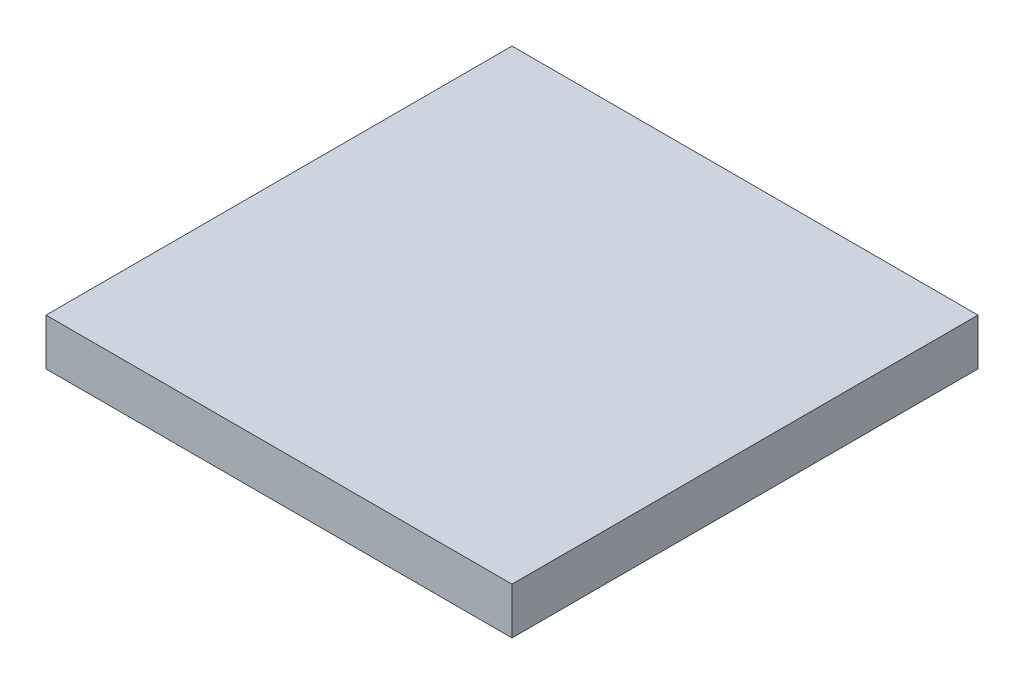
ISO-10303-21;
HEADER;
FILE_DESCRIPTION(('STEP AP214'),'2;1');
FILE_NAME('part.step','',(''),(''),'','','');
FILE_SCHEMA(('AUTOMOTIVE_DESIGN { 1 0 10303 214 1 1 1 1 }'));
ENDSEC;
DATA;
#1=APPLICATION_CONTEXT('core data for automotive mechanical design processes');
#2=APPLICATION_PROTOCOL_DEFINITION('international standard','automotive_design',2000,#1);
#3=PRODUCT_CONTEXT('',#1,'mechanical');
#4=PRODUCT('Part','Part','',(#3));
#5=PRODUCT_RELATED_PRODUCT_CATEGORY('part','',(#4));
#6=PRODUCT_DEFINITION_FORMATION('','',#4);
#7=PRODUCT_DEFINITION_CONTEXT('part definition',#1,'design');
#8=PRODUCT_DEFINITION('design','',#6,#7);
#9=PRODUCT_DEFINITION_SHAPE('','',#8);
#10=(LENGTH_UNIT() NAMED_UNIT(*) SI_UNIT(.MILLI.,.METRE.));
#11=(NAMED_UNIT(*) PLANE_ANGLE_UNIT() SI_UNIT($,.RADIAN.));
#12=(NAMED_UNIT(*) SI_UNIT($,.STERADIAN.) SOLID_ANGLE_UNIT());
#13=UNCERTAINTY_MEASURE_WITH_UNIT(LENGTH_MEASURE(1.E-05),#10,'distance_accuracy_value','');
#14=(GEOMETRIC_REPRESENTATION_CONTEXT(3) GLOBAL_UNCERTAINTY_ASSIGNED_CONTEXT((#13)) GLOBAL_UNIT_ASSIGNED_CONTEXT((#10,
#11,#12)) REPRESENTATION_CONTEXT('',''));
#15=CARTESIAN_POINT('',(0.,0.,0.));
#16=DIRECTION('',(0.,0.,1.));
#17=DIRECTION('',(1.,0.,0.));
#18=AXIS2_PLACEMENT_3D('',#15,#16,#17);
#19=CARTESIAN_POINT('',(0.,2.,0.));
#20=DIRECTION('',(1.,0.,0.));
#21=DIRECTION('',(0.,0.,-1.));
#22=AXIS2_PLACEMENT_3D('',#19,#20,#21);
#23=PLANE('',#22);
#24=DIRECTION('',(0.,0.,1.));
#25=VECTOR('',#24,1.);
#26=CARTESIAN_POINT('',(0.,0.,0.));
#27=LINE('',#26,#25);
#28=CARTESIAN_POINT('',(0.,0.,-20.));
#29=VERTEX_POINT('',#28);
#30=CARTESIAN_POINT('',(0.,0.,0.));
#31=VERTEX_POINT('',#30);
#32=EDGE_CURVE('E102',#29,#31,#27,.T.);
#33=ORIENTED_EDGE('',*,*,#32,.T.);
#34=DIRECTION('',(0.,-1.,0.));
#35=VECTOR('',#34,1.);
#36=CARTESIAN_POINT('',(0.,2.,0.));
#37=LINE('',#36,#35);
#38=CARTESIAN_POINT('',(0.,2.,0.));
#39=VERTEX_POINT('',#38);
#40=EDGE_CURVE('E11',#39,#31,#37,.T.);
#41=ORIENTED_EDGE('',*,*,#40,.F.);
#42=DIRECTION('',(0.,0.,1.));
#43=VECTOR('',#42,1.);
#44=CARTESIAN_POINT('',(0.,2.,0.));
#45=LINE('',#44,#43);
#46=CARTESIAN_POINT('',(0.,2.,-20.));
#47=VERTEX_POINT('',#46);
#48=EDGE_CURVE('E90',#47,#39,#45,.T.);
#49=ORIENTED_EDGE('',*,*,#48,.F.);
#50=DIRECTION('',(0.,-1.,0.));
#51=VECTOR('',#50,1.);
#52=CARTESIAN_POINT('',(0.,2.,-20.));
#53=LINE('',#52,#51);
#54=EDGE_CURVE('E98',#47,#29,#53,.T.);
#55=ORIENTED_EDGE('',*,*,#54,.T.);
#56=EDGE_LOOP('',(#33,#41,#49,#55));
#57=FACE_BOUND('',#56,.T.);
#58=ADVANCED_FACE('F39',(#57),#23,.F.);
#59=CARTESIAN_POINT('',(0.,2.,0.));
#60=DIRECTION('',(0.,0.,-1.));
#61=DIRECTION('',(-1.,0.,0.));
#62=AXIS2_PLACEMENT_3D('',#59,#60,#61);
#63=PLANE('',#62);
#64=DIRECTION('',(1.,0.,0.));
#65=VECTOR('',#64,1.);
#66=CARTESIAN_POINT('',(0.,0.,0.));
#67=LINE('',#66,#65);
#68=CARTESIAN_POINT('',(20.,0.,0.));
#69=VERTEX_POINT('',#68);
#70=EDGE_CURVE('E94',#31,#69,#67,.T.);
#71=ORIENTED_EDGE('',*,*,#70,.T.);
#72=DIRECTION('',(0.,-1.,0.));
#73=VECTOR('',#72,1.);
#74=CARTESIAN_POINT('',(20.,2.,0.));
#75=LINE('',#74,#73);
#76=CARTESIAN_POINT('',(20.,2.,0.));
#77=VERTEX_POINT('',#76);
#78=EDGE_CURVE('E47',#77,#69,#75,.T.);
#79=ORIENTED_EDGE('',*,*,#78,.F.);
#80=DIRECTION('',(1.,0.,0.));
#81=VECTOR('',#80,1.);
#82=CARTESIAN_POINT('',(0.,2.,0.));
#83=LINE('',#82,#81);
#84=EDGE_CURVE('E85',#39,#77,#83,.T.);
#85=ORIENTED_EDGE('',*,*,#84,.F.);
#86=ORIENTED_EDGE('',*,*,#40,.T.);
#87=EDGE_LOOP('',(#71,#79,#85,#86));
#88=FACE_BOUND('',#87,.T.);
#89=ADVANCED_FACE('F93',(#88),#63,.F.);
#90=CARTESIAN_POINT('',(20.,2.,0.));
#91=DIRECTION('',(-1.,0.,0.));
#92=DIRECTION('',(0.,0.,1.));
#93=AXIS2_PLACEMENT_3D('',#90,#91,#92);
#94=PLANE('',#93);
#95=DIRECTION('',(0.,0.,-1.));
#96=VECTOR('',#95,1.);
#97=CARTESIAN_POINT('',(20.,0.,0.));
#98=LINE('',#97,#96);
#99=CARTESIAN_POINT('',(20.,0.,-20.));
#100=VERTEX_POINT('',#99);
#101=EDGE_CURVE('E72',#69,#100,#98,.T.);
#102=ORIENTED_EDGE('',*,*,#101,.T.);
#103=DIRECTION('',(0.,-1.,0.));
#104=VECTOR('',#103,1.);
#105=CARTESIAN_POINT('',(20.,2.,-20.));
#106=LINE('',#105,#104);
#107=CARTESIAN_POINT('',(20.,2.,-20.));
#108=VERTEX_POINT('',#107);
#109=EDGE_CURVE('E95',#108,#100,#106,.T.);
#110=ORIENTED_EDGE('',*,*,#109,.F.);
#111=DIRECTION('',(0.,0.,-1.));
#112=VECTOR('',#111,1.);
#113=CARTESIAN_POINT('',(20.,2.,0.));
#114=LINE('',#113,#112);
#115=EDGE_CURVE('E88',#77,#108,#114,.T.);
#116=ORIENTED_EDGE('',*,*,#115,.F.);
#117=ORIENTED_EDGE('',*,*,#78,.T.);
#118=EDGE_LOOP('',(#102,#110,#116,#117));
#119=FACE_BOUND('',#118,.T.);
#120=ADVANCED_FACE('F96',(#119),#94,.F.);
#121=CARTESIAN_POINT('',(0.,2.,-20.));
#122=DIRECTION('',(0.,0.,1.));
#123=DIRECTION('',(1.,0.,0.));
#124=AXIS2_PLACEMENT_3D('',#121,#122,#123);
#125=PLANE('',#124);
#126=DIRECTION('',(-1.,0.,0.));
#127=VECTOR('',#126,1.);
#128=CARTESIAN_POINT('',(0.,0.,-20.));
#129=LINE('',#128,#127);
#130=EDGE_CURVE('E78',#100,#29,#129,.T.);
#131=ORIENTED_EDGE('',*,*,#130,.T.);
#132=ORIENTED_EDGE('',*,*,#54,.F.);
#133=DIRECTION('',(-1.,0.,0.));
#134=VECTOR('',#133,1.);
#135=CARTESIAN_POINT('',(0.,2.,-20.));
#136=LINE('',#135,#134);
#137=EDGE_CURVE('E55',#108,#47,#136,.T.);
#138=ORIENTED_EDGE('',*,*,#137,.F.);
#139=ORIENTED_EDGE('',*,*,#109,.T.);
#140=EDGE_LOOP('',(#131,#132,#138,#139));
#141=FACE_BOUND('',#140,.T.);
#142=ADVANCED_FACE('F109',(#141),#125,.F.);
#143=CARTESIAN_POINT('',(0.,2.,0.));
#144=DIRECTION('',(0.,-1.,0.));
#145=DIRECTION('',(0.,0.,-1.));
#146=AXIS2_PLACEMENT_3D('',#143,#144,#145);
#147=PLANE('',#146);
#148=ORIENTED_EDGE('',*,*,#48,.T.);
#149=ORIENTED_EDGE('',*,*,#84,.T.);
#150=ORIENTED_EDGE('',*,*,#115,.T.);
#151=ORIENTED_EDGE('',*,*,#137,.T.);
#152=EDGE_LOOP('',(#148,#149,#150,#151));
#153=FACE_BOUND('',#152,.T.);
#154=ADVANCED_FACE('F86',(#153),#147,.F.);
#155=CARTESIAN_POINT('',(0.,0.,0.));
#156=DIRECTION('',(0.,-1.,0.));
#157=DIRECTION('',(0.,0.,-1.));
#158=AXIS2_PLACEMENT_3D('',#155,#156,#157);
#159=PLANE('',#158);
#160=ORIENTED_EDGE('',*,*,#32,.F.);
#161=ORIENTED_EDGE('',*,*,#130,.F.);
#162=ORIENTED_EDGE('',*,*,#101,.F.);
#163=ORIENTED_EDGE('',*,*,#70,.F.);
#164=EDGE_LOOP('',(#160,#161,#162,#163));
#165=FACE_BOUND('',#164,.T.);
#166=ADVANCED_FACE('F112',(#165),#159,.T.);
#167=CLOSED_SHELL('',(#58,#89,#120,#142,#154,#166));
#168=MANIFOLD_SOLID_BREP('B2',#167);
#169=ADVANCED_BREP_SHAPE_REPRESENTATION('',(#18,#168),#14);
#170=SHAPE_DEFINITION_REPRESENTATION(#9,#169);
ENDSEC;
END-ISO-10303-21;
